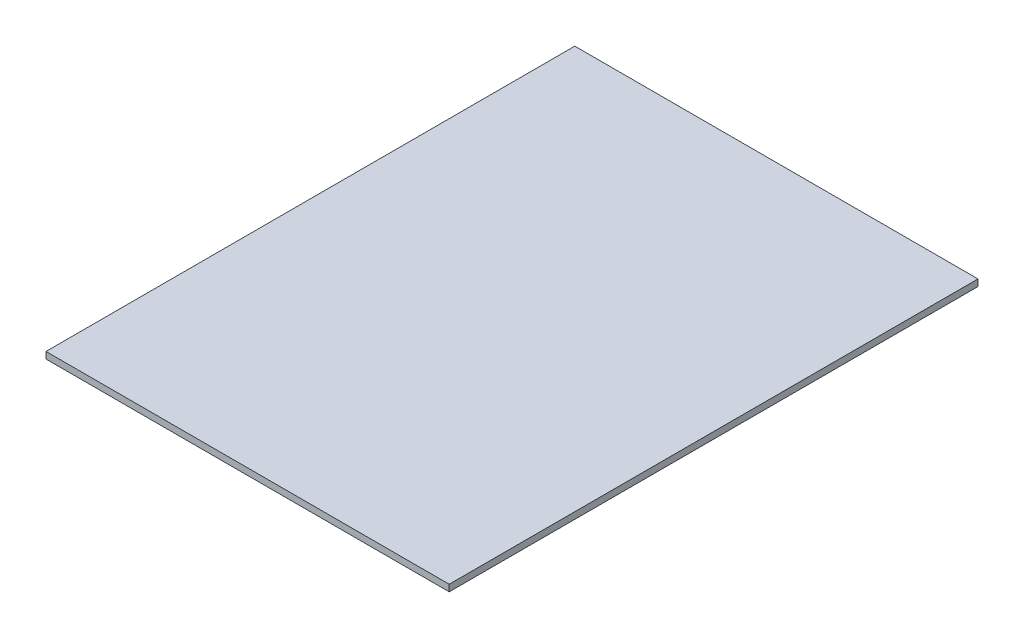
ISO-10303-21;
HEADER;
FILE_DESCRIPTION(('STEP AP214'),'2;1');
FILE_NAME('part.step','',(''),(''),'','','');
FILE_SCHEMA(('AUTOMOTIVE_DESIGN { 1 0 10303 214 1 1 1 1 }'));
ENDSEC;
DATA;
#1=APPLICATION_CONTEXT('core data for automotive mechanical design processes');
#2=APPLICATION_PROTOCOL_DEFINITION('international standard','automotive_design',2000,#1);
#3=PRODUCT_CONTEXT('',#1,'mechanical');
#4=PRODUCT('Part','Part','',(#3));
#5=PRODUCT_RELATED_PRODUCT_CATEGORY('part','',(#4));
#6=PRODUCT_DEFINITION_FORMATION('','',#4);
#7=PRODUCT_DEFINITION_CONTEXT('part definition',#1,'design');
#8=PRODUCT_DEFINITION('design','',#6,#7);
#9=PRODUCT_DEFINITION_SHAPE('','',#8);
#10=(LENGTH_UNIT() NAMED_UNIT(*) SI_UNIT(.MILLI.,.METRE.));
#11=(NAMED_UNIT(*) PLANE_ANGLE_UNIT() SI_UNIT($,.RADIAN.));
#12=(NAMED_UNIT(*) SI_UNIT($,.STERADIAN.) SOLID_ANGLE_UNIT());
#13=UNCERTAINTY_MEASURE_WITH_UNIT(LENGTH_MEASURE(1.E-05),#10,'distance_accuracy_value','');
#14=(GEOMETRIC_REPRESENTATION_CONTEXT(3) GLOBAL_UNCERTAINTY_ASSIGNED_CONTEXT((#13)) GLOBAL_UNIT_ASSIGNED_CONTEXT((#10,
#11,#12)) REPRESENTATION_CONTEXT('',''));
#15=CARTESIAN_POINT('',(0.,0.,0.));
#16=DIRECTION('',(0.,0.,1.));
#17=DIRECTION('',(1.,0.,0.));
#18=AXIS2_PLACEMENT_3D('',#15,#16,#17);
#19=CARTESIAN_POINT('',(-193.675,6.35,-254.));
#20=DIRECTION('',(1.,0.,0.));
#21=DIRECTION('',(0.,0.,-1.));
#22=AXIS2_PLACEMENT_3D('',#19,#20,#21);
#23=PLANE('',#22);
#24=DIRECTION('',(0.,0.,1.));
#25=VECTOR('',#24,1.);
#26=CARTESIAN_POINT('',(-193.675,0.,-254.));
#27=LINE('',#26,#25);
#28=CARTESIAN_POINT('',(-193.675,0.,-254.));
#29=VERTEX_POINT('',#28);
#30=CARTESIAN_POINT('',(-193.675,0.,254.));
#31=VERTEX_POINT('',#30);
#32=EDGE_CURVE('E98',#29,#31,#27,.T.);
#33=ORIENTED_EDGE('',*,*,#32,.T.);
#34=DIRECTION('',(0.,-1.,0.));
#35=VECTOR('',#34,1.);
#36=CARTESIAN_POINT('',(-193.675,6.35,254.));
#37=LINE('',#36,#35);
#38=CARTESIAN_POINT('',(-193.675,6.35,254.));
#39=VERTEX_POINT('',#38);
#40=EDGE_CURVE('E11',#39,#31,#37,.T.);
#41=ORIENTED_EDGE('',*,*,#40,.F.);
#42=DIRECTION('',(0.,0.,1.));
#43=VECTOR('',#42,1.);
#44=CARTESIAN_POINT('',(-193.675,6.35,-254.));
#45=LINE('',#44,#43);
#46=CARTESIAN_POINT('',(-193.675,6.35,-254.));
#47=VERTEX_POINT('',#46);
#48=EDGE_CURVE('E86',#47,#39,#45,.T.);
#49=ORIENTED_EDGE('',*,*,#48,.F.);
#50=DIRECTION('',(0.,-1.,0.));
#51=VECTOR('',#50,1.);
#52=CARTESIAN_POINT('',(-193.675,6.35,-254.));
#53=LINE('',#52,#51);
#54=EDGE_CURVE('E94',#47,#29,#53,.T.);
#55=ORIENTED_EDGE('',*,*,#54,.T.);
#56=EDGE_LOOP('',(#33,#41,#49,#55));
#57=FACE_BOUND('',#56,.T.);
#58=ADVANCED_FACE('F35',(#57),#23,.F.);
#59=CARTESIAN_POINT('',(-193.675,6.35,254.));
#60=DIRECTION('',(0.,0.,-1.));
#61=DIRECTION('',(-1.,0.,0.));
#62=AXIS2_PLACEMENT_3D('',#59,#60,#61);
#63=PLANE('',#62);
#64=DIRECTION('',(1.,0.,0.));
#65=VECTOR('',#64,1.);
#66=CARTESIAN_POINT('',(-193.675,0.,254.));
#67=LINE('',#66,#65);
#68=CARTESIAN_POINT('',(193.675,0.,254.));
#69=VERTEX_POINT('',#68);
#70=EDGE_CURVE('E90',#31,#69,#67,.T.);
#71=ORIENTED_EDGE('',*,*,#70,.T.);
#72=DIRECTION('',(0.,-1.,0.));
#73=VECTOR('',#72,1.);
#74=CARTESIAN_POINT('',(193.675,6.35,254.));
#75=LINE('',#74,#73);
#76=CARTESIAN_POINT('',(193.675,6.35,254.));
#77=VERTEX_POINT('',#76);
#78=EDGE_CURVE('E43',#77,#69,#75,.T.);
#79=ORIENTED_EDGE('',*,*,#78,.F.);
#80=DIRECTION('',(1.,0.,0.));
#81=VECTOR('',#80,1.);
#82=CARTESIAN_POINT('',(-193.675,6.35,254.));
#83=LINE('',#82,#81);
#84=EDGE_CURVE('E81',#39,#77,#83,.T.);
#85=ORIENTED_EDGE('',*,*,#84,.F.);
#86=ORIENTED_EDGE('',*,*,#40,.T.);
#87=EDGE_LOOP('',(#71,#79,#85,#86));
#88=FACE_BOUND('',#87,.T.);
#89=ADVANCED_FACE('F89',(#88),#63,.F.);
#90=CARTESIAN_POINT('',(193.675,6.35,-254.));
#91=DIRECTION('',(-1.,0.,0.));
#92=DIRECTION('',(0.,0.,1.));
#93=AXIS2_PLACEMENT_3D('',#90,#91,#92);
#94=PLANE('',#93);
#95=DIRECTION('',(0.,0.,-1.));
#96=VECTOR('',#95,1.);
#97=CARTESIAN_POINT('',(193.675,0.,-254.));
#98=LINE('',#97,#96);
#99=CARTESIAN_POINT('',(193.675,0.,-254.));
#100=VERTEX_POINT('',#99);
#101=EDGE_CURVE('E68',#69,#100,#98,.T.);
#102=ORIENTED_EDGE('',*,*,#101,.T.);
#103=DIRECTION('',(0.,-1.,0.));
#104=VECTOR('',#103,1.);
#105=CARTESIAN_POINT('',(193.675,6.35,-254.));
#106=LINE('',#105,#104);
#107=CARTESIAN_POINT('',(193.675,6.35,-254.));
#108=VERTEX_POINT('',#107);
#109=EDGE_CURVE('E91',#108,#100,#106,.T.);
#110=ORIENTED_EDGE('',*,*,#109,.F.);
#111=DIRECTION('',(0.,0.,-1.));
#112=VECTOR('',#111,1.);
#113=CARTESIAN_POINT('',(193.675,6.35,-254.));
#114=LINE('',#113,#112);
#115=EDGE_CURVE('E84',#77,#108,#114,.T.);
#116=ORIENTED_EDGE('',*,*,#115,.F.);
#117=ORIENTED_EDGE('',*,*,#78,.T.);
#118=EDGE_LOOP('',(#102,#110,#116,#117));
#119=FACE_BOUND('',#118,.T.);
#120=ADVANCED_FACE('F92',(#119),#94,.F.);
#121=CARTESIAN_POINT('',(-193.675,6.35,-254.));
#122=DIRECTION('',(0.,0.,1.));
#123=DIRECTION('',(1.,0.,0.));
#124=AXIS2_PLACEMENT_3D('',#121,#122,#123);
#125=PLANE('',#124);
#126=DIRECTION('',(-1.,0.,0.));
#127=VECTOR('',#126,1.);
#128=CARTESIAN_POINT('',(-193.675,0.,-254.));
#129=LINE('',#128,#127);
#130=EDGE_CURVE('E74',#100,#29,#129,.T.);
#131=ORIENTED_EDGE('',*,*,#130,.T.);
#132=ORIENTED_EDGE('',*,*,#54,.F.);
#133=DIRECTION('',(-1.,0.,0.));
#134=VECTOR('',#133,1.);
#135=CARTESIAN_POINT('',(-193.675,6.35,-254.));
#136=LINE('',#135,#134);
#137=EDGE_CURVE('E51',#108,#47,#136,.T.);
#138=ORIENTED_EDGE('',*,*,#137,.F.);
#139=ORIENTED_EDGE('',*,*,#109,.T.);
#140=EDGE_LOOP('',(#131,#132,#138,#139));
#141=FACE_BOUND('',#140,.T.);
#142=ADVANCED_FACE('F105',(#141),#125,.F.);
#143=CARTESIAN_POINT('',(0.,6.35,0.));
#144=DIRECTION('',(0.,1.,0.));
#145=DIRECTION('',(0.,0.,1.));
#146=AXIS2_PLACEMENT_3D('',#143,#144,#145);
#147=PLANE('',#146);
#148=ORIENTED_EDGE('',*,*,#48,.T.);
#149=ORIENTED_EDGE('',*,*,#84,.T.);
#150=ORIENTED_EDGE('',*,*,#115,.T.);
#151=ORIENTED_EDGE('',*,*,#137,.T.);
#152=EDGE_LOOP('',(#148,#149,#150,#151));
#153=FACE_BOUND('',#152,.T.);
#154=ADVANCED_FACE('F82',(#153),#147,.T.);
#155=CARTESIAN_POINT('',(0.,0.,0.));
#156=DIRECTION('',(0.,1.,0.));
#157=DIRECTION('',(0.,0.,1.));
#158=AXIS2_PLACEMENT_3D('',#155,#156,#157);
#159=PLANE('',#158);
#160=ORIENTED_EDGE('',*,*,#32,.F.);
#161=ORIENTED_EDGE('',*,*,#130,.F.);
#162=ORIENTED_EDGE('',*,*,#101,.F.);
#163=ORIENTED_EDGE('',*,*,#70,.F.);
#164=EDGE_LOOP('',(#160,#161,#162,#163));
#165=FACE_BOUND('',#164,.T.);
#166=ADVANCED_FACE('F108',(#165),#159,.F.);
#167=CLOSED_SHELL('',(#58,#89,#120,#142,#154,#166));
#168=MANIFOLD_SOLID_BREP('B2',#167);
#169=ADVANCED_BREP_SHAPE_REPRESENTATION('',(#18,#168),#14);
#170=SHAPE_DEFINITION_REPRESENTATION(#9,#169);
ENDSEC;
END-ISO-10303-21;
